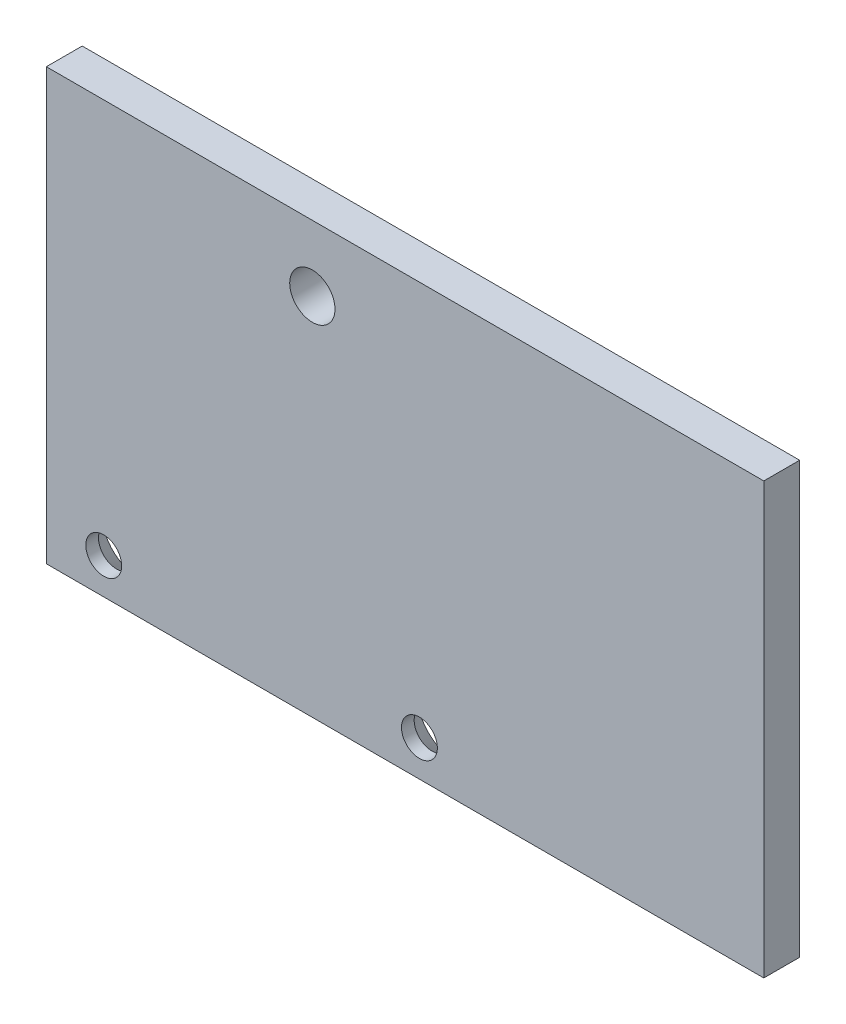
ISO-10303-21;
HEADER;
FILE_DESCRIPTION(('STEP AP214'),'2;1');
FILE_NAME('part.step','',(''),(''),'','','');
FILE_SCHEMA(('AUTOMOTIVE_DESIGN { 1 0 10303 214 1 1 1 1 }'));
ENDSEC;
DATA;
#1=APPLICATION_CONTEXT('core data for automotive mechanical design processes');
#2=APPLICATION_PROTOCOL_DEFINITION('international standard','automotive_design',2000,#1);
#3=PRODUCT_CONTEXT('',#1,'mechanical');
#4=PRODUCT('Part','Part','',(#3));
#5=PRODUCT_RELATED_PRODUCT_CATEGORY('part','',(#4));
#6=PRODUCT_DEFINITION_FORMATION('','',#4);
#7=PRODUCT_DEFINITION_CONTEXT('part definition',#1,'design');
#8=PRODUCT_DEFINITION('design','',#6,#7);
#9=PRODUCT_DEFINITION_SHAPE('','',#8);
#10=(LENGTH_UNIT() NAMED_UNIT(*) SI_UNIT(.MILLI.,.METRE.));
#11=(NAMED_UNIT(*) PLANE_ANGLE_UNIT() SI_UNIT($,.RADIAN.));
#12=(NAMED_UNIT(*) SI_UNIT($,.STERADIAN.) SOLID_ANGLE_UNIT());
#13=UNCERTAINTY_MEASURE_WITH_UNIT(LENGTH_MEASURE(1.E-05),#10,'distance_accuracy_value','');
#14=(GEOMETRIC_REPRESENTATION_CONTEXT(3) GLOBAL_UNCERTAINTY_ASSIGNED_CONTEXT((#13)) GLOBAL_UNIT_ASSIGNED_CONTEXT((#10,
#11,#12)) REPRESENTATION_CONTEXT('',''));
#15=CARTESIAN_POINT('',(0.,0.,0.));
#16=DIRECTION('',(0.,0.,1.));
#17=DIRECTION('',(1.,0.,0.));
#18=AXIS2_PLACEMENT_3D('',#15,#16,#17);
#19=CARTESIAN_POINT('',(0.,0.,6.35));
#20=DIRECTION('',(-1.,0.,0.));
#21=DIRECTION('',(0.,-1.,0.));
#22=AXIS2_PLACEMENT_3D('',#19,#20,#21);
#23=PLANE('',#22);
#24=DIRECTION('',(0.,1.,0.));
#25=VECTOR('',#24,1.);
#26=CARTESIAN_POINT('',(0.,0.,0.));
#27=LINE('',#26,#25);
#28=CARTESIAN_POINT('',(0.,0.,0.));
#29=VERTEX_POINT('',#28);
#30=CARTESIAN_POINT('',(0.,76.2,0.));
#31=VERTEX_POINT('',#30);
#32=EDGE_CURVE('E121',#29,#31,#27,.T.);
#33=ORIENTED_EDGE('',*,*,#32,.T.);
#34=DIRECTION('',(0.,0.,-1.));
#35=VECTOR('',#34,1.);
#36=CARTESIAN_POINT('',(0.,76.2,6.35));
#37=LINE('',#36,#35);
#38=CARTESIAN_POINT('',(0.,76.2,6.35));
#39=VERTEX_POINT('',#38);
#40=EDGE_CURVE('E175',#39,#31,#37,.T.);
#41=ORIENTED_EDGE('',*,*,#40,.F.);
#42=DIRECTION('',(0.,1.,0.));
#43=VECTOR('',#42,1.);
#44=CARTESIAN_POINT('',(0.,0.,6.35));
#45=LINE('',#44,#43);
#46=CARTESIAN_POINT('',(0.,0.,6.35));
#47=VERTEX_POINT('',#46);
#48=EDGE_CURVE('E106',#47,#39,#45,.T.);
#49=ORIENTED_EDGE('',*,*,#48,.F.);
#50=DIRECTION('',(0.,0.,-1.));
#51=VECTOR('',#50,1.);
#52=CARTESIAN_POINT('',(0.,0.,6.35));
#53=LINE('',#52,#51);
#54=EDGE_CURVE('E129',#47,#29,#53,.T.);
#55=ORIENTED_EDGE('',*,*,#54,.T.);
#56=EDGE_LOOP('',(#33,#41,#49,#55));
#57=FACE_BOUND('',#56,.T.);
#58=ADVANCED_FACE('F34',(#57),#23,.F.);
#59=CARTESIAN_POINT('',(0.,76.2,6.35));
#60=DIRECTION('',(0.,-1.,0.));
#61=DIRECTION('',(1.,0.,0.));
#62=AXIS2_PLACEMENT_3D('',#59,#60,#61);
#63=PLANE('',#62);
#64=DIRECTION('',(-1.,0.,0.));
#65=VECTOR('',#64,1.);
#66=CARTESIAN_POINT('',(0.,76.2,0.));
#67=LINE('',#66,#65);
#68=CARTESIAN_POINT('',(-127.,76.2,0.));
#69=VERTEX_POINT('',#68);
#70=EDGE_CURVE('E118',#31,#69,#67,.T.);
#71=ORIENTED_EDGE('',*,*,#70,.T.);
#72=DIRECTION('',(0.,0.,-1.));
#73=VECTOR('',#72,1.);
#74=CARTESIAN_POINT('',(-127.,76.2,6.35));
#75=LINE('',#74,#73);
#76=CARTESIAN_POINT('',(-127.,76.2,6.35));
#77=VERTEX_POINT('',#76);
#78=EDGE_CURVE('E177',#77,#69,#75,.T.);
#79=ORIENTED_EDGE('',*,*,#78,.F.);
#80=DIRECTION('',(-1.,0.,0.));
#81=VECTOR('',#80,1.);
#82=CARTESIAN_POINT('',(0.,76.2,6.35));
#83=LINE('',#82,#81);
#84=EDGE_CURVE('E110',#39,#77,#83,.T.);
#85=ORIENTED_EDGE('',*,*,#84,.F.);
#86=ORIENTED_EDGE('',*,*,#40,.T.);
#87=EDGE_LOOP('',(#71,#79,#85,#86));
#88=FACE_BOUND('',#87,.T.);
#89=ADVANCED_FACE('F164',(#88),#63,.F.);
#90=CARTESIAN_POINT('',(-127.,0.,6.35));
#91=DIRECTION('',(1.,0.,0.));
#92=DIRECTION('',(0.,0.,-1.));
#93=AXIS2_PLACEMENT_3D('',#90,#91,#92);
#94=PLANE('',#93);
#95=DIRECTION('',(0.,-1.,0.));
#96=VECTOR('',#95,1.);
#97=CARTESIAN_POINT('',(-127.,0.,0.));
#98=LINE('',#97,#96);
#99=CARTESIAN_POINT('',(-127.,0.,0.));
#100=VERTEX_POINT('',#99);
#101=EDGE_CURVE('E114',#69,#100,#98,.T.);
#102=ORIENTED_EDGE('',*,*,#101,.T.);
#103=DIRECTION('',(0.,0.,-1.));
#104=VECTOR('',#103,1.);
#105=CARTESIAN_POINT('',(-127.,0.,6.35));
#106=LINE('',#105,#104);
#107=CARTESIAN_POINT('',(-127.,0.,6.35));
#108=VERTEX_POINT('',#107);
#109=EDGE_CURVE('E105',#108,#100,#106,.T.);
#110=ORIENTED_EDGE('',*,*,#109,.F.);
#111=DIRECTION('',(0.,-1.,0.));
#112=VECTOR('',#111,1.);
#113=CARTESIAN_POINT('',(-127.,0.,6.35));
#114=LINE('',#113,#112);
#115=EDGE_CURVE('E130',#77,#108,#114,.T.);
#116=ORIENTED_EDGE('',*,*,#115,.F.);
#117=ORIENTED_EDGE('',*,*,#78,.T.);
#118=EDGE_LOOP('',(#102,#110,#116,#117));
#119=FACE_BOUND('',#118,.T.);
#120=ADVANCED_FACE('F169',(#119),#94,.F.);
#121=CARTESIAN_POINT('',(0.,0.,6.35));
#122=DIRECTION('',(0.,1.,0.));
#123=DIRECTION('',(-1.,0.,0.));
#124=AXIS2_PLACEMENT_3D('',#121,#122,#123);
#125=PLANE('',#124);
#126=DIRECTION('',(1.,0.,0.));
#127=VECTOR('',#126,1.);
#128=CARTESIAN_POINT('',(0.,0.,0.));
#129=LINE('',#128,#127);
#130=CARTESIAN_POINT('',(-119.110460237485,0.,0.));
#131=VERTEX_POINT('',#130);
#132=EDGE_CURVE('E97',#100,#131,#129,.T.);
#133=ORIENTED_EDGE('',*,*,#132,.T.);
#134=CARTESIAN_POINT('',(-128.812649068424,0.,-7.83248281445128));
#135=CARTESIAN_POINT('',(-128.571884849846,0.,-7.5878262152866));
#136=CARTESIAN_POINT('',(-128.330333220246,0.,-7.34393890849861));
#137=CARTESIAN_POINT('',(-127.845311046456,0.,-6.85805201470797));
#138=CARTESIAN_POINT('',(-127.601840389621,0.,-6.61605254020353));
#139=CARTESIAN_POINT('',(-127.112122590797,0.,-6.13378583715921));
#140=CARTESIAN_POINT('',(-126.865870492606,0.,-5.89352363418536));
#141=CARTESIAN_POINT('',(-126.370690339219,0.,-5.41578007117357));
#142=CARTESIAN_POINT('',(-126.121762342363,0.,-5.17829865074528));
#143=CARTESIAN_POINT('',(-125.607849236859,0.,-4.69468440289561));
#144=CARTESIAN_POINT('',(-125.342694634456,0.,-4.44873130051314));
#145=CARTESIAN_POINT('',(-124.808010171889,0.,-3.96163077128048));
#146=CARTESIAN_POINT('',(-124.538480448323,0.,-3.72048319491589));
#147=CARTESIAN_POINT('',(-123.994221868033,0.,-3.24462572547518));
#148=CARTESIAN_POINT('',(-123.719498099653,0.,-3.00991003287843));
#149=CARTESIAN_POINT('',(-123.16323563994,0.,-2.54872542762217));
#150=CARTESIAN_POINT('',(-122.881697904145,0.,-2.32225536968509));
#151=CARTESIAN_POINT('',(-122.323360917705,0.,-1.89089555872711));
#152=CARTESIAN_POINT('',(-122.046960836009,0.,-1.68549180425967));
#153=CARTESIAN_POINT('',(-121.483957571677,0.,-1.28851655834962));
#154=CARTESIAN_POINT('',(-121.197347314659,0.,-1.09695494747329));
#155=CARTESIAN_POINT('',(-120.759931990837,0.,-0.825707800156575));
#156=CARTESIAN_POINT('',(-120.613818905992,0.,-0.738473918882423));
#157=CARTESIAN_POINT('',(-120.318256178012,0.,-0.569869289786872));
#158=CARTESIAN_POINT('',(-120.168806226272,0.,-0.488499087225327));
#159=CARTESIAN_POINT('',(-119.715427907802,0.,-0.255097539397919));
#160=CARTESIAN_POINT('',(-119.405890197814,0.,-0.113404673494414));
#161=CARTESIAN_POINT('',(-118.95997532153,0.,0.0578204907383647));
#162=CARTESIAN_POINT('',(-118.829911879348,0.,0.103994799002913));
#163=CARTESIAN_POINT('',(-118.567041230686,0.,0.188943573882665));
#164=CARTESIAN_POINT('',(-118.434228469826,0.,0.227701018211834));
#165=CARTESIAN_POINT('',(-118.138359599084,0.,0.303977427474464));
#166=CARTESIAN_POINT('',(-117.97479079572,0.,0.339539916912516));
#167=CARTESIAN_POINT('',(-117.645182838012,0.,0.396793869133038));
#168=CARTESIAN_POINT('',(-117.47914321592,0.,0.418482670419165));
#169=CARTESIAN_POINT('',(-117.145982807463,0.,0.446917302717706));
#170=CARTESIAN_POINT('',(-116.978863660434,0.,0.453682060986916));
#171=CARTESIAN_POINT('',(-116.64471515396,0.,0.45197384935072));
#172=CARTESIAN_POINT('',(-116.47768578899,0.,0.443501959860449));
#173=CARTESIAN_POINT('',(-116.150365923706,0.,0.412267199305405));
#174=CARTESIAN_POINT('',(-115.990030334251,0.,0.389968490150697));
#175=CARTESIAN_POINT('',(-115.671677209841,0.,0.332492566351471));
#176=CARTESIAN_POINT('',(-115.513660166655,0.,0.297312659491311));
#177=CARTESIAN_POINT('',(-115.200410790528,0.,0.21537142962786));
#178=CARTESIAN_POINT('',(-115.045183501725,0.,0.16859102662427));
#179=CARTESIAN_POINT('',(-114.738148326281,0.,0.0649883379276899));
#180=CARTESIAN_POINT('',(-114.586340513394,0.,0.00816583587486205));
#181=CARTESIAN_POINT('',(-114.249473927245,0.,-0.129022539886639));
#182=CARTESIAN_POINT('',(-114.065379177048,0.,-0.211745952397383));
#183=CARTESIAN_POINT('',(-113.702390490899,0.,-0.387973608615274));
#184=CARTESIAN_POINT('',(-113.52349876181,0.,-0.481482345769266));
#185=CARTESIAN_POINT('',(-113.170257991991,0.,-0.677334010158204));
#186=CARTESIAN_POINT('',(-112.995917073912,0.,-0.77969149177117));
#187=CARTESIAN_POINT('',(-112.651601534814,0.,-0.991416791185509));
#188=CARTESIAN_POINT('',(-112.481626364592,0.,-1.10078372110008));
#189=CARTESIAN_POINT('',(-112.142954295716,0.,-1.32692612173214));
#190=CARTESIAN_POINT('',(-111.974315868838,0.,-1.44378878875914));
#191=CARTESIAN_POINT('',(-111.640479886034,0.,-1.6823214734457));
#192=CARTESIAN_POINT('',(-111.475282422348,0.,-1.80399161972435));
#193=CARTESIAN_POINT('',(-111.148055115123,0.,-2.05116858246165));
#194=CARTESIAN_POINT('',(-110.986022224026,0.,-2.17667137558438));
#195=CARTESIAN_POINT('',(-110.664574426994,0.,-2.43096469301047));
#196=CARTESIAN_POINT('',(-110.505159413534,0.,-2.55975508172446));
#197=CARTESIAN_POINT('',(-110.163151901307,0.,-2.84103643462227));
#198=CARTESIAN_POINT('',(-109.980955087117,0.,-2.99400793089389));
#199=CARTESIAN_POINT('',(-109.619192176889,0.,-3.30303480829104));
#200=CARTESIAN_POINT('',(-109.439626171889,0.,-3.4590902957008));
#201=CARTESIAN_POINT('',(-108.90426530495,0.,-3.93113685720115));
#202=CARTESIAN_POINT('',(-108.551855794834,0.,-4.25096792457911));
#203=CARTESIAN_POINT('',(-107.853637729244,0.,-4.8981218593126));
#204=CARTESIAN_POINT('',(-107.507833231651,0.,-5.22544907668313));
#205=CARTESIAN_POINT('',(-106.821497358243,0.,-5.88552632337631));
#206=CARTESIAN_POINT('',(-106.480965605267,0.,-6.21827596130317));
#207=CARTESIAN_POINT('',(-105.803125251873,0.,-6.88881042832302));
#208=CARTESIAN_POINT('',(-105.465827528027,0.,-7.22660622732189));
#209=CARTESIAN_POINT('',(-104.794526282785,0.,-7.90546143111328));
#210=CARTESIAN_POINT('',(-104.460522813243,0.,-8.24652088711108));
#211=CARTESIAN_POINT('',(-103.795299937466,0.,-8.93111396050567));
#212=CARTESIAN_POINT('',(-103.464079615727,0.,-9.2746466892811));
#213=CARTESIAN_POINT('',(-102.803828900869,0.,-9.96381125723824));
#214=CARTESIAN_POINT('',(-102.474798517772,0.,-10.309443106012));
#215=CARTESIAN_POINT('',(-101.571166872069,0.,-11.2636441422322));
#216=CARTESIAN_POINT('',(-100.998443915611,0.,-11.8739917556482));
#217=CARTESIAN_POINT('',(-99.8570483324696,0.,-13.0985672554247));
#218=CARTESIAN_POINT('',(-99.28837611006,0.,-13.7127955178531));
#219=CARTESIAN_POINT('',(-98.1568801357325,0.,-14.9411786818691));
#220=CARTESIAN_POINT('',(-97.5940414146348,0.,-15.5553198026836));
#221=CARTESIAN_POINT('',(-96.7516278753797,0.,-16.4781475357693));
#222=CARTESIAN_POINT('',(-96.4711471008888,0.,-16.7860081084238));
#223=CARTESIAN_POINT('',(-95.9107261771033,0.,-17.402220174715));
#224=CARTESIAN_POINT('',(-95.6307860270496,0.,-17.7105716676613));
#225=CARTESIAN_POINT('',(-95.3510842164008,0.,-18.0191392530377));
#226=B_SPLINE_CURVE_WITH_KNOTS('',3,(#134,#135,#136,#137,#138,#139,#140,#141,#142,#143,#144,
#145,#146,#147,#148,#149,#150,#151,#152,#153,#154,#155,#156,#157,#158,#159,#160,#161,#162,#163,
#164,#165,#166,#167,#168,#169,#170,#171,#172,#173,#174,#175,#176,#177,#178,#179,#180,#181,#182,
#183,#184,#185,#186,#187,#188,#189,#190,#191,#192,#193,#194,#195,#196,#197,#198,#199,#200,#201,
#202,#203,#204,#205,#206,#207,#208,#209,#210,#211,#212,#213,#214,#215,#216,#217,#218,#219,#220,
#221,#222,#223,#224,#225),.UNSPECIFIED.,.F.,.F.,(4,2,2,2,2,2,2,2,2,2,2,2,2,2,2,2,2,2,2,2,2,2,2,
2,2,2,2,2,2,2,2,2,2,2,2,2,2,2,2,2,2,2,2,2,2,4),(0.,1.02977032758739,2.05960155872818,
3.09171435713965,4.12380469939262,5.2087468793319,6.29365525058131,7.37755084453011,
8.46129531196554,9.49410574022171,10.5276462546907,11.0380353173462,11.548471779684,
12.5672830526691,12.981155938196,13.3959675925453,13.897585883871,14.3993003756566,
14.9003782067713,15.4014205083696,15.8864910967452,16.3716631245042,16.8576384977062,
17.3436243426606,17.9486559747691,18.5539405955688,19.1602404504899,19.7664636566198,
20.3818798955962,20.997312610554,21.6121200934519,22.2269022608592,22.9405564474395,
23.6542352718741,25.0817809607408,26.5101771679686,27.9384707248317,29.3705332921223,
30.8026183647771,32.2342123069696,33.665812795842,36.1767241452392,38.687882674482,
41.1869958019448,42.4364065446118,43.6858155319037),.UNSPECIFIED.);
#227=CARTESIAN_POINT('',(-114.569539762515,0.,0.));
#228=VERTEX_POINT('',#227);
#229=EDGE_CURVE('E11',#131,#228,#226,.T.);
#230=ORIENTED_EDGE('',*,*,#229,.T.);
#231=CARTESIAN_POINT('',(-63.2304602374849,0.,0.));
#232=VERTEX_POINT('',#231);
#233=EDGE_CURVE('E98',#228,#232,#129,.T.);
#234=ORIENTED_EDGE('',*,*,#233,.T.);
#235=CARTESIAN_POINT('',(-72.9326490684234,0.,-7.83248281445113));
#236=CARTESIAN_POINT('',(-72.691884849846,0.,-7.58782621528646));
#237=CARTESIAN_POINT('',(-72.4503332202456,0.,-7.34393890849848));
#238=CARTESIAN_POINT('',(-71.9653110464557,0.,-6.85805201470784));
#239=CARTESIAN_POINT('',(-71.721840389621,0.,-6.61605254020339));
#240=CARTESIAN_POINT('',(-71.2321225907973,0.,-6.13378583715909));
#241=CARTESIAN_POINT('',(-70.9858704926059,0.,-5.89352363418524));
#242=CARTESIAN_POINT('',(-70.4906903392193,0.,-5.41578007117346));
#243=CARTESIAN_POINT('',(-70.2417623423628,0.,-5.17829865074517));
#244=CARTESIAN_POINT('',(-69.7278492368591,0.,-4.69468440289551));
#245=CARTESIAN_POINT('',(-69.4626946344559,0.,-4.44873130051305));
#246=CARTESIAN_POINT('',(-68.9280101718889,0.,-3.9616307712804));
#247=CARTESIAN_POINT('',(-68.6584804483233,0.,-3.72048319491582));
#248=CARTESIAN_POINT('',(-68.1142218680326,0.,-3.24462572547511));
#249=CARTESIAN_POINT('',(-67.8394980996531,0.,-3.00991003287836));
#250=CARTESIAN_POINT('',(-67.2832356399396,0.,-2.54872542762211));
#251=CARTESIAN_POINT('',(-67.0016979041445,0.,-2.32225536968505));
#252=CARTESIAN_POINT('',(-66.4433609177046,0.,-1.89089555872707));
#253=CARTESIAN_POINT('',(-66.1669608360091,0.,-1.68549180425964));
#254=CARTESIAN_POINT('',(-65.6039575716773,0.,-1.2885165583496));
#255=CARTESIAN_POINT('',(-65.3173473146592,0.,-1.09695494747327));
#256=CARTESIAN_POINT('',(-64.8799319908374,0.,-0.825707800156561));
#257=CARTESIAN_POINT('',(-64.7338189059919,0.,-0.738473918882409));
#258=CARTESIAN_POINT('',(-64.4382561780118,0.,-0.569869289786858));
#259=CARTESIAN_POINT('',(-64.2888062262721,0.,-0.488499087225313));
#260=CARTESIAN_POINT('',(-63.8354279078018,0.,-0.255097539397907));
#261=CARTESIAN_POINT('',(-63.5258901978142,0.,-0.113404673494403));
#262=CARTESIAN_POINT('',(-63.0799753215296,0.,0.0578204907383727));
#263=CARTESIAN_POINT('',(-62.9499118793478,0.,0.103994799002919));
#264=CARTESIAN_POINT('',(-62.6870412306864,0.,0.188943573882671));
#265=CARTESIAN_POINT('',(-62.5542284698258,0.,0.227701018211841));
#266=CARTESIAN_POINT('',(-62.258359599084,0.,0.303977427474471));
#267=CARTESIAN_POINT('',(-62.0947907957201,0.,0.339539916912521));
#268=CARTESIAN_POINT('',(-61.7651828380124,0.,0.396793869133041));
#269=CARTESIAN_POINT('',(-61.5991432159204,0.,0.418482670419167));
#270=CARTESIAN_POINT('',(-61.2659828074629,0.,0.446917302717708));
#271=CARTESIAN_POINT('',(-61.0988636604338,0.,0.453682060986917));
#272=CARTESIAN_POINT('',(-60.7647151539602,0.,0.451973849350719));
#273=CARTESIAN_POINT('',(-60.5976857889895,0.,0.443501959860446));
#274=CARTESIAN_POINT('',(-60.2703659237064,0.,0.412267199305402));
#275=CARTESIAN_POINT('',(-60.1100303342515,0.,0.389968490150695));
#276=CARTESIAN_POINT('',(-59.7916772098406,0.,0.332492566351467));
#277=CARTESIAN_POINT('',(-59.633660166655,0.,0.297312659491305));
#278=CARTESIAN_POINT('',(-59.3204107905282,0.,0.215371429627854));
#279=CARTESIAN_POINT('',(-59.165183501725,0.,0.168591026624267));
#280=CARTESIAN_POINT('',(-58.8581483262812,0.,0.0649883379276908));
#281=CARTESIAN_POINT('',(-58.7063405133936,0.,0.00816583587486381));
#282=CARTESIAN_POINT('',(-58.3694739272445,0.,-0.129022539886634));
#283=CARTESIAN_POINT('',(-58.185379177048,0.,-0.211745952397375));
#284=CARTESIAN_POINT('',(-57.8223904908995,0.,-0.387973608615262));
#285=CARTESIAN_POINT('',(-57.6434987618102,0.,-0.481482345769253));
#286=CARTESIAN_POINT('',(-57.290257991991,0.,-0.677334010158193));
#287=CARTESIAN_POINT('',(-57.1159170739118,0.,-0.779691491771162));
#288=CARTESIAN_POINT('',(-56.771601534814,0.,-0.991416791185497));
#289=CARTESIAN_POINT('',(-56.6016263645919,0.,-1.10078372110006));
#290=CARTESIAN_POINT('',(-56.2629542957159,0.,-1.32692612173212));
#291=CARTESIAN_POINT('',(-56.0943158688381,0.,-1.44378878875912));
#292=CARTESIAN_POINT('',(-55.7604798860342,0.,-1.68232147344568));
#293=CARTESIAN_POINT('',(-55.5952824223484,0.,-1.80399161972432));
#294=CARTESIAN_POINT('',(-55.2680551151227,0.,-2.05116858246162));
#295=CARTESIAN_POINT('',(-55.1060222240258,0.,-2.17667137558435));
#296=CARTESIAN_POINT('',(-54.7845744269937,0.,-2.43096469301044));
#297=CARTESIAN_POINT('',(-54.6251594135343,0.,-2.55975508172443));
#298=CARTESIAN_POINT('',(-54.2831519013075,0.,-2.84103643462223));
#299=CARTESIAN_POINT('',(-54.1009550871175,0.,-2.99400793089386));
#300=CARTESIAN_POINT('',(-53.7391921768887,0.,-3.303034808291));
#301=CARTESIAN_POINT('',(-53.5596261718889,0.,-3.45909029570076));
#302=CARTESIAN_POINT('',(-53.0242653049497,0.,-3.9311368572011));
#303=CARTESIAN_POINT('',(-52.6718557948338,0.,-4.25096792457907));
#304=CARTESIAN_POINT('',(-51.9736377292443,0.,-4.89812185931254));
#305=CARTESIAN_POINT('',(-51.6278332316512,0.,-5.22544907668306));
#306=CARTESIAN_POINT('',(-50.9414973582434,0.,-5.88552632337623));
#307=CARTESIAN_POINT('',(-50.6009656052666,0.,-6.21827596130309));
#308=CARTESIAN_POINT('',(-49.9231252518727,0.,-6.88881042832294));
#309=CARTESIAN_POINT('',(-49.5858275280269,0.,-7.2266062273218));
#310=CARTESIAN_POINT('',(-48.9145262827856,0.,-7.90546143111318));
#311=CARTESIAN_POINT('',(-48.5805228132431,0.,-8.24652088711098));
#312=CARTESIAN_POINT('',(-47.9152999374664,0.,-8.93111396050556));
#313=CARTESIAN_POINT('',(-47.584079615727,0.,-9.27464668928098));
#314=CARTESIAN_POINT('',(-46.923828900869,0.,-9.96381125723811));
#315=CARTESIAN_POINT('',(-46.5947985177718,0.,-10.3094431060119));
#316=CARTESIAN_POINT('',(-45.6911668720693,0.,-11.263644142232));
#317=CARTESIAN_POINT('',(-45.1184439156113,0.,-11.8739917556481));
#318=CARTESIAN_POINT('',(-43.9770483324698,0.,-13.0985672554245));
#319=CARTESIAN_POINT('',(-43.4083761100602,0.,-13.7127955178529));
#320=CARTESIAN_POINT('',(-42.2768801357327,0.,-14.9411786818689));
#321=CARTESIAN_POINT('',(-41.714041414635,0.,-15.5553198026834));
#322=CARTESIAN_POINT('',(-40.8716278753799,0.,-16.4781475357691));
#323=CARTESIAN_POINT('',(-40.591147100889,0.,-16.7860081084236));
#324=CARTESIAN_POINT('',(-40.0307261771035,0.,-17.4022201747148));
#325=CARTESIAN_POINT('',(-39.7507860270498,0.,-17.710571667661));
#326=CARTESIAN_POINT('',(-39.4710842164011,0.,-18.0191392530375));
#327=B_SPLINE_CURVE_WITH_KNOTS('',3,(#235,#236,#237,#238,#239,#240,#241,#242,#243,#244,#245,
#246,#247,#248,#249,#250,#251,#252,#253,#254,#255,#256,#257,#258,#259,#260,#261,#262,#263,#264,
#265,#266,#267,#268,#269,#270,#271,#272,#273,#274,#275,#276,#277,#278,#279,#280,#281,#282,#283,
#284,#285,#286,#287,#288,#289,#290,#291,#292,#293,#294,#295,#296,#297,#298,#299,#300,#301,#302,
#303,#304,#305,#306,#307,#308,#309,#310,#311,#312,#313,#314,#315,#316,#317,#318,#319,#320,#321,
#322,#323,#324,#325,#326),.UNSPECIFIED.,.F.,.F.,(4,2,2,2,2,2,2,2,2,2,2,2,2,2,2,2,2,2,2,2,2,2,2,
2,2,2,2,2,2,2,2,2,2,2,2,2,2,2,2,2,2,2,2,2,2,4),(0.,1.02977032758738,2.05960155872814,
3.09171435713959,4.12380469939254,5.2087468793318,6.29365525058121,7.37755084452998,
8.46129531196538,9.49410574022154,10.5276462546905,11.038035317346,11.5484717796838,
12.5672830526689,12.9811559381958,13.3959675925451,13.8975858838708,14.3993003756564,
14.9003782067711,15.4014205083693,15.886491096745,16.371663124504,16.857638497706,
17.3436243426603,17.9486559747688,18.5539405955685,19.1602404504897,19.7664636566195,
20.3818798955959,20.9973126105538,21.6121200934516,22.2269022608589,22.9405564474392,
23.6542352718738,25.0817809607405,26.5101771679683,27.9384707248314,29.3705332921219,
30.8026183647767,32.2342123069692,33.6658127958415,36.1767241452387,38.6878826744815,
41.1869958019443,42.4364065446113,43.6858155319031),.UNSPECIFIED.);
#328=CARTESIAN_POINT('',(-58.6895397625151,0.,0.));
#329=VERTEX_POINT('',#328);
#330=EDGE_CURVE('E47',#232,#329,#327,.T.);
#331=ORIENTED_EDGE('',*,*,#330,.T.);
#332=EDGE_CURVE('E108',#329,#29,#129,.T.);
#333=ORIENTED_EDGE('',*,*,#332,.T.);
#334=ORIENTED_EDGE('',*,*,#54,.F.);
#335=DIRECTION('',(1.,0.,0.));
#336=VECTOR('',#335,1.);
#337=CARTESIAN_POINT('',(0.,0.,6.35));
#338=LINE('',#337,#336);
#339=EDGE_CURVE('E127',#108,#47,#338,.T.);
#340=ORIENTED_EDGE('',*,*,#339,.F.);
#341=ORIENTED_EDGE('',*,*,#109,.T.);
#342=EDGE_LOOP('',(#133,#230,#234,#331,#333,#334,#340,#341));
#343=FACE_BOUND('',#342,.T.);
#344=ADVANCED_FACE('F102',(#343),#125,.F.);
#345=CARTESIAN_POINT('',(0.,0.,6.35));
#346=DIRECTION('',(0.,0.,1.));
#347=DIRECTION('',(1.,0.,0.));
#348=AXIS2_PLACEMENT_3D('',#345,#346,#347);
#349=PLANE('',#348);
#350=CARTESIAN_POINT('',(-116.84,6.34999999999999,6.35));
#351=DIRECTION('',(0.,0.,-1.));
#352=DIRECTION('',(-1.,0.,0.));
#353=AXIS2_PLACEMENT_3D('',#350,#351,#352);
#354=CIRCLE('',#353,3.175);
#355=CARTESIAN_POINT('',(-120.015,6.34999999999999,6.35));
#356=VERTEX_POINT('',#355);
#357=EDGE_CURVE('E143',#356,#356,#354,.T.);
#358=ORIENTED_EDGE('',*,*,#357,.T.);
#359=EDGE_LOOP('',(#358));
#360=FACE_BOUND('',#359,.T.);
#361=CARTESIAN_POINT('',(-60.96,6.34999999999999,6.35));
#362=DIRECTION('',(0.,0.,-1.));
#363=DIRECTION('',(-1.,0.,0.));
#364=AXIS2_PLACEMENT_3D('',#361,#362,#363);
#365=CIRCLE('',#364,3.175);
#366=CARTESIAN_POINT('',(-64.135,6.34999999999999,6.35));
#367=VERTEX_POINT('',#366);
#368=EDGE_CURVE('E136',#367,#367,#365,.T.);
#369=ORIENTED_EDGE('',*,*,#368,.T.);
#370=EDGE_LOOP('',(#369));
#371=FACE_BOUND('',#370,.T.);
#372=CARTESIAN_POINT('',(-79.912500047,64.5730381646381,6.35));
#373=DIRECTION('',(0.,0.,-1.));
#374=DIRECTION('',(-1.,0.,0.));
#375=AXIS2_PLACEMENT_3D('',#372,#373,#374);
#376=CIRCLE('',#375,4.01);
#377=CARTESIAN_POINT('',(-83.922500047,64.5730381646381,6.35));
#378=VERTEX_POINT('',#377);
#379=EDGE_CURVE('E133',#378,#378,#376,.T.);
#380=ORIENTED_EDGE('',*,*,#379,.T.);
#381=EDGE_LOOP('',(#380));
#382=FACE_BOUND('',#381,.T.);
#383=ORIENTED_EDGE('',*,*,#48,.T.);
#384=ORIENTED_EDGE('',*,*,#84,.T.);
#385=ORIENTED_EDGE('',*,*,#115,.T.);
#386=ORIENTED_EDGE('',*,*,#339,.T.);
#387=EDGE_LOOP('',(#383,#384,#385,#386));
#388=FACE_BOUND('',#387,.T.);
#389=ADVANCED_FACE('F199',(#360,#371,#382,#388),#349,.T.);
#390=CARTESIAN_POINT('',(0.,0.,0.));
#391=DIRECTION('',(0.,0.,1.));
#392=DIRECTION('',(1.,0.,0.));
#393=AXIS2_PLACEMENT_3D('',#390,#391,#392);
#394=PLANE('',#393);
#395=CARTESIAN_POINT('',(-79.912500047,64.5730381646381,0.));
#396=DIRECTION('',(0.,0.,1.));
#397=DIRECTION('',(1.,0.,0.));
#398=AXIS2_PLACEMENT_3D('',#395,#396,#397);
#399=CIRCLE('',#398,4.01);
#400=CARTESIAN_POINT('',(-75.902500047,64.5730381646381,0.));
#401=VERTEX_POINT('',#400);
#402=EDGE_CURVE('E126',#401,#401,#399,.T.);
#403=ORIENTED_EDGE('',*,*,#402,.T.);
#404=EDGE_LOOP('',(#403));
#405=FACE_BOUND('',#404,.T.);
#406=ORIENTED_EDGE('',*,*,#233,.F.);
#407=CARTESIAN_POINT('',(-116.84,6.34999999999999,0.));
#408=DIRECTION('',(0.,0.,-1.));
#409=DIRECTION('',(-1.,0.,0.));
#410=AXIS2_PLACEMENT_3D('',#407,#408,#409);
#411=CIRCLE('',#410,6.7437);
#412=EDGE_CURVE('E53',#131,#228,#411,.T.);
#413=ORIENTED_EDGE('',*,*,#412,.F.);
#414=ORIENTED_EDGE('',*,*,#132,.F.);
#415=ORIENTED_EDGE('',*,*,#101,.F.);
#416=ORIENTED_EDGE('',*,*,#70,.F.);
#417=ORIENTED_EDGE('',*,*,#32,.F.);
#418=ORIENTED_EDGE('',*,*,#332,.F.);
#419=CARTESIAN_POINT('',(-60.96,6.34999999999999,0.));
#420=DIRECTION('',(0.,0.,-1.));
#421=DIRECTION('',(-1.,0.,0.));
#422=AXIS2_PLACEMENT_3D('',#419,#420,#421);
#423=CIRCLE('',#422,6.7437);
#424=EDGE_CURVE('E59',#232,#329,#423,.T.);
#425=ORIENTED_EDGE('',*,*,#424,.F.);
#426=EDGE_LOOP('',(#406,#413,#414,#415,#416,#417,#418,#425));
#427=FACE_BOUND('',#426,.T.);
#428=ADVANCED_FACE('F95',(#405,#427),#394,.F.);
#429=CARTESIAN_POINT('',(-79.912500047,64.5730381646381,6.35));
#430=DIRECTION('',(0.,0.,-1.));
#431=DIRECTION('',(-1.,0.,0.));
#432=AXIS2_PLACEMENT_3D('',#429,#430,#431);
#433=CYLINDRICAL_SURFACE('',#432,4.01);
#434=ORIENTED_EDGE('',*,*,#379,.F.);
#435=EDGE_LOOP('',(#434));
#436=FACE_BOUND('',#435,.T.);
#437=ORIENTED_EDGE('',*,*,#402,.F.);
#438=EDGE_LOOP('',(#437));
#439=FACE_BOUND('',#438,.T.);
#440=ADVANCED_FACE('F193',(#436,#439),#433,.F.);
#441=CARTESIAN_POINT('',(-60.96,6.34999999999999,0.));
#442=DIRECTION('',(0.,0.,-1.));
#443=DIRECTION('',(-1.,0.,0.));
#444=AXIS2_PLACEMENT_3D('',#441,#442,#443);
#445=CONICAL_SURFACE('',#444,6.7437,0.715584993317676);
#446=CARTESIAN_POINT('',(-60.96,6.34999999999999,4.10531973484961));
#447=DIRECTION('',(0.,0.,-1.));
#448=DIRECTION('',(-1.,0.,0.));
#449=AXIS2_PLACEMENT_3D('',#446,#447,#448);
#450=CIRCLE('',#449,3.175);
#451=CARTESIAN_POINT('',(-64.135,6.34999999999999,4.10531973484961));
#452=VERTEX_POINT('',#451);
#453=EDGE_CURVE('E139',#452,#452,#450,.T.);
#454=ORIENTED_EDGE('',*,*,#453,.F.);
#455=EDGE_LOOP('',(#454));
#456=FACE_BOUND('',#455,.T.);
#457=ORIENTED_EDGE('',*,*,#424,.T.);
#458=ORIENTED_EDGE('',*,*,#330,.F.);
#459=EDGE_LOOP('',(#457,#458));
#460=FACE_BOUND('',#459,.T.);
#461=ADVANCED_FACE('F159',(#456,#460),#445,.F.);
#462=CARTESIAN_POINT('',(-60.96,6.34999999999999,0.));
#463=DIRECTION('',(0.,0.,-1.));
#464=DIRECTION('',(-1.,0.,0.));
#465=AXIS2_PLACEMENT_3D('',#462,#463,#464);
#466=CYLINDRICAL_SURFACE('',#465,3.175);
#467=ORIENTED_EDGE('',*,*,#368,.F.);
#468=EDGE_LOOP('',(#467));
#469=FACE_BOUND('',#468,.T.);
#470=ORIENTED_EDGE('',*,*,#453,.T.);
#471=EDGE_LOOP('',(#470));
#472=FACE_BOUND('',#471,.T.);
#473=ADVANCED_FACE('F152',(#469,#472),#466,.F.);
#474=CARTESIAN_POINT('',(-116.84,6.34999999999999,0.));
#475=DIRECTION('',(0.,0.,-1.));
#476=DIRECTION('',(-1.,0.,0.));
#477=AXIS2_PLACEMENT_3D('',#474,#475,#476);
#478=CONICAL_SURFACE('',#477,6.7437,0.715584993317676);
#479=CARTESIAN_POINT('',(-116.84,6.34999999999999,4.10531973484961));
#480=DIRECTION('',(0.,0.,-1.));
#481=DIRECTION('',(-1.,0.,0.));
#482=AXIS2_PLACEMENT_3D('',#479,#480,#481);
#483=CIRCLE('',#482,3.175);
#484=CARTESIAN_POINT('',(-120.015,6.34999999999999,4.10531973484961));
#485=VERTEX_POINT('',#484);
#486=EDGE_CURVE('E99',#485,#485,#483,.T.);
#487=ORIENTED_EDGE('',*,*,#486,.F.);
#488=EDGE_LOOP('',(#487));
#489=FACE_BOUND('',#488,.T.);
#490=ORIENTED_EDGE('',*,*,#412,.T.);
#491=ORIENTED_EDGE('',*,*,#229,.F.);
#492=EDGE_LOOP('',(#490,#491));
#493=FACE_BOUND('',#492,.T.);
#494=ADVANCED_FACE('F89',(#489,#493),#478,.F.);
#495=CARTESIAN_POINT('',(-116.84,6.34999999999999,0.));
#496=DIRECTION('',(0.,0.,-1.));
#497=DIRECTION('',(-1.,0.,0.));
#498=AXIS2_PLACEMENT_3D('',#495,#496,#497);
#499=CYLINDRICAL_SURFACE('',#498,3.175);
#500=ORIENTED_EDGE('',*,*,#357,.F.);
#501=EDGE_LOOP('',(#500));
#502=FACE_BOUND('',#501,.T.);
#503=ORIENTED_EDGE('',*,*,#486,.T.);
#504=EDGE_LOOP('',(#503));
#505=FACE_BOUND('',#504,.T.);
#506=ADVANCED_FACE('F149',(#502,#505),#499,.F.);
#507=CLOSED_SHELL('',(#58,#89,#120,#344,#389,#428,#440,#461,#473,#494,#506));
#508=MANIFOLD_SOLID_BREP('B2',#507);
#509=ADVANCED_BREP_SHAPE_REPRESENTATION('',(#18,#508),#14);
#510=SHAPE_DEFINITION_REPRESENTATION(#9,#509);
ENDSEC;
END-ISO-10303-21;
